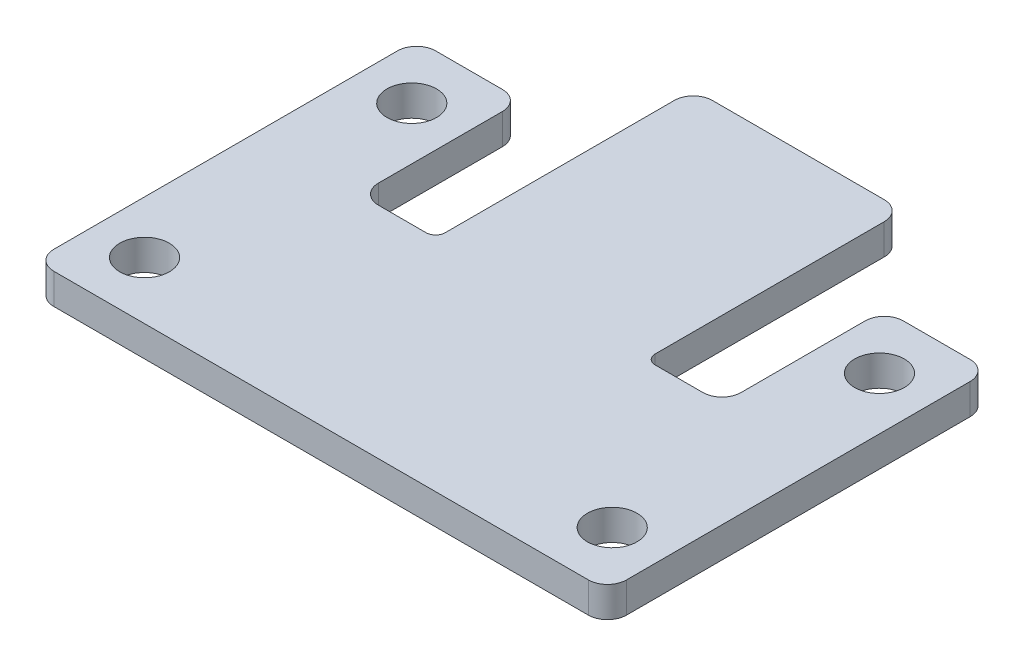
ISO-10303-21;
HEADER;
FILE_DESCRIPTION(('STEP AP214'),'2;1');
FILE_NAME('part.step','',(''),(''),'','','');
FILE_SCHEMA(('AUTOMOTIVE_DESIGN { 1 0 10303 214 1 1 1 1 }'));
ENDSEC;
DATA;
#1=APPLICATION_CONTEXT('core data for automotive mechanical design processes');
#2=APPLICATION_PROTOCOL_DEFINITION('international standard','automotive_design',2000,#1);
#3=PRODUCT_CONTEXT('',#1,'mechanical');
#4=PRODUCT('Part','Part','',(#3));
#5=PRODUCT_RELATED_PRODUCT_CATEGORY('part','',(#4));
#6=PRODUCT_DEFINITION_FORMATION('','',#4);
#7=PRODUCT_DEFINITION_CONTEXT('part definition',#1,'design');
#8=PRODUCT_DEFINITION('design','',#6,#7);
#9=PRODUCT_DEFINITION_SHAPE('','',#8);
#10=(LENGTH_UNIT() NAMED_UNIT(*) SI_UNIT(.MILLI.,.METRE.));
#11=(NAMED_UNIT(*) PLANE_ANGLE_UNIT() SI_UNIT($,.RADIAN.));
#12=(NAMED_UNIT(*) SI_UNIT($,.STERADIAN.) SOLID_ANGLE_UNIT());
#13=UNCERTAINTY_MEASURE_WITH_UNIT(LENGTH_MEASURE(1.E-05),#10,'distance_accuracy_value','');
#14=(GEOMETRIC_REPRESENTATION_CONTEXT(3) GLOBAL_UNCERTAINTY_ASSIGNED_CONTEXT((#13)) GLOBAL_UNIT_ASSIGNED_CONTEXT((#10,
#11,#12)) REPRESENTATION_CONTEXT('',''));
#15=CARTESIAN_POINT('',(0.,0.,0.));
#16=DIRECTION('',(0.,0.,1.));
#17=DIRECTION('',(1.,0.,0.));
#18=AXIS2_PLACEMENT_3D('',#15,#16,#17);
#19=CARTESIAN_POINT('',(0.,0.,0.));
#20=DIRECTION('',(0.,1.,0.));
#21=DIRECTION('',(0.,0.,1.));
#22=AXIS2_PLACEMENT_3D('',#19,#20,#21);
#23=PLANE('',#22);
#24=CARTESIAN_POINT('',(-12.25,0.,-17.));
#25=DIRECTION('',(0.,1.,0.));
#26=DIRECTION('',(0.,0.,1.));
#27=AXIS2_PLACEMENT_3D('',#24,#25,#26);
#28=CIRCLE('',#27,1.3);
#29=CARTESIAN_POINT('',(-12.25,0.,-15.7));
#30=VERTEX_POINT('',#29);
#31=EDGE_CURVE('E618',#30,#30,#28,.F.);
#32=ORIENTED_EDGE('',*,*,#31,.F.);
#33=EDGE_LOOP('',(#32));
#34=FACE_BOUND('',#33,.T.);
#35=CARTESIAN_POINT('',(12.25,0.,-17.));
#36=DIRECTION('',(0.,1.,0.));
#37=DIRECTION('',(0.,0.,1.));
#38=AXIS2_PLACEMENT_3D('',#35,#36,#37);
#39=CIRCLE('',#38,1.3);
#40=CARTESIAN_POINT('',(12.25,0.,-15.7));
#41=VERTEX_POINT('',#40);
#42=EDGE_CURVE('E227',#41,#41,#39,.F.);
#43=ORIENTED_EDGE('',*,*,#42,.F.);
#44=EDGE_LOOP('',(#43));
#45=FACE_BOUND('',#44,.T.);
#46=DIRECTION('',(-1.,0.,0.));
#47=VECTOR('',#46,1.);
#48=CARTESIAN_POINT('',(-9.5,0.,-20.));
#49=LINE('',#48,#47);
#50=CARTESIAN_POINT('',(-10.5,0.,-20.));
#51=VERTEX_POINT('',#50);
#52=CARTESIAN_POINT('',(-14.,0.,-20.));
#53=VERTEX_POINT('',#52);
#54=EDGE_CURVE('E216',#51,#53,#49,.T.);
#55=ORIENTED_EDGE('',*,*,#54,.F.);
#56=CARTESIAN_POINT('',(-10.5,0.,-19.));
#57=DIRECTION('',(0.,1.,0.));
#58=DIRECTION('',(0.,0.,1.));
#59=AXIS2_PLACEMENT_3D('',#56,#57,#58);
#60=CIRCLE('',#59,1.);
#61=CARTESIAN_POINT('',(-9.5,0.,-19.));
#62=VERTEX_POINT('',#61);
#63=EDGE_CURVE('E200',#51,#62,#60,.F.);
#64=ORIENTED_EDGE('',*,*,#63,.T.);
#65=DIRECTION('',(0.,0.,-1.));
#66=VECTOR('',#65,1.);
#67=CARTESIAN_POINT('',(-9.5,0.,-11.5));
#68=LINE('',#67,#66);
#69=CARTESIAN_POINT('',(-9.5,0.,-12.5));
#70=VERTEX_POINT('',#69);
#71=EDGE_CURVE('E262',#70,#62,#68,.T.);
#72=ORIENTED_EDGE('',*,*,#71,.F.);
#73=CARTESIAN_POINT('',(-8.5,0.,-12.5));
#74=DIRECTION('',(0.,1.,0.));
#75=DIRECTION('',(0.,0.,1.));
#76=AXIS2_PLACEMENT_3D('',#73,#74,#75);
#77=CIRCLE('',#76,1.);
#78=CARTESIAN_POINT('',(-8.5,0.,-11.5));
#79=VERTEX_POINT('',#78);
#80=EDGE_CURVE('E338',#70,#79,#77,.T.);
#81=ORIENTED_EDGE('',*,*,#80,.T.);
#82=DIRECTION('',(-1.,0.,0.));
#83=VECTOR('',#82,1.);
#84=CARTESIAN_POINT('',(-5.5,0.,-11.5));
#85=LINE('',#84,#83);
#86=CARTESIAN_POINT('',(-6.,0.,-11.5));
#87=VERTEX_POINT('',#86);
#88=EDGE_CURVE('E260',#87,#79,#85,.T.);
#89=ORIENTED_EDGE('',*,*,#88,.F.);
#90=CARTESIAN_POINT('',(-6.,0.,-12.));
#91=DIRECTION('',(0.,1.,0.));
#92=DIRECTION('',(0.,0.,1.));
#93=AXIS2_PLACEMENT_3D('',#90,#91,#92);
#94=CIRCLE('',#93,0.5);
#95=CARTESIAN_POINT('',(-5.5,0.,-12.));
#96=VERTEX_POINT('',#95);
#97=EDGE_CURVE('E47',#87,#96,#94,.T.);
#98=ORIENTED_EDGE('',*,*,#97,.T.);
#99=DIRECTION('',(0.,0.,1.));
#100=VECTOR('',#99,1.);
#101=CARTESIAN_POINT('',(-5.5,0.,-25.));
#102=LINE('',#101,#100);
#103=CARTESIAN_POINT('',(-5.5,0.,-24.));
#104=VERTEX_POINT('',#103);
#105=EDGE_CURVE('E258',#104,#96,#102,.T.);
#106=ORIENTED_EDGE('',*,*,#105,.F.);
#107=CARTESIAN_POINT('',(-4.5,0.,-24.));
#108=DIRECTION('',(0.,1.,0.));
#109=DIRECTION('',(0.,0.,1.));
#110=AXIS2_PLACEMENT_3D('',#107,#108,#109);
#111=CIRCLE('',#110,1.);
#112=CARTESIAN_POINT('',(-4.5,0.,-25.));
#113=VERTEX_POINT('',#112);
#114=EDGE_CURVE('E210',#104,#113,#111,.F.);
#115=ORIENTED_EDGE('',*,*,#114,.T.);
#116=DIRECTION('',(-1.,0.,0.));
#117=VECTOR('',#116,1.);
#118=CARTESIAN_POINT('',(5.5,0.,-25.));
#119=LINE('',#118,#117);
#120=CARTESIAN_POINT('',(4.5,0.,-25.));
#121=VERTEX_POINT('',#120);
#122=EDGE_CURVE('E255',#121,#113,#119,.T.);
#123=ORIENTED_EDGE('',*,*,#122,.F.);
#124=CARTESIAN_POINT('',(4.5,0.,-24.));
#125=DIRECTION('',(0.,1.,0.));
#126=DIRECTION('',(0.,0.,1.));
#127=AXIS2_PLACEMENT_3D('',#124,#125,#126);
#128=CIRCLE('',#127,1.);
#129=CARTESIAN_POINT('',(5.5,0.,-24.));
#130=VERTEX_POINT('',#129);
#131=EDGE_CURVE('E273',#121,#130,#128,.F.);
#132=ORIENTED_EDGE('',*,*,#131,.T.);
#133=DIRECTION('',(0.,0.,-1.));
#134=VECTOR('',#133,1.);
#135=CARTESIAN_POINT('',(5.5,0.,-11.5));
#136=LINE('',#135,#134);
#137=CARTESIAN_POINT('',(5.5,0.,-12.));
#138=VERTEX_POINT('',#137);
#139=EDGE_CURVE('E253',#138,#130,#136,.T.);
#140=ORIENTED_EDGE('',*,*,#139,.F.);
#141=CARTESIAN_POINT('',(6.,0.,-12.));
#142=DIRECTION('',(0.,1.,0.));
#143=DIRECTION('',(0.,0.,1.));
#144=AXIS2_PLACEMENT_3D('',#141,#142,#143);
#145=CIRCLE('',#144,0.5);
#146=CARTESIAN_POINT('',(6.,0.,-11.5));
#147=VERTEX_POINT('',#146);
#148=EDGE_CURVE('E356',#138,#147,#145,.T.);
#149=ORIENTED_EDGE('',*,*,#148,.T.);
#150=DIRECTION('',(-1.,0.,0.));
#151=VECTOR('',#150,1.);
#152=CARTESIAN_POINT('',(9.5,0.,-11.5));
#153=LINE('',#152,#151);
#154=CARTESIAN_POINT('',(8.5,0.,-11.5));
#155=VERTEX_POINT('',#154);
#156=EDGE_CURVE('E250',#155,#147,#153,.T.);
#157=ORIENTED_EDGE('',*,*,#156,.F.);
#158=CARTESIAN_POINT('',(8.5,0.,-12.5));
#159=DIRECTION('',(0.,1.,0.));
#160=DIRECTION('',(0.,0.,1.));
#161=AXIS2_PLACEMENT_3D('',#158,#159,#160);
#162=CIRCLE('',#161,1.);
#163=CARTESIAN_POINT('',(9.5,0.,-12.5));
#164=VERTEX_POINT('',#163);
#165=EDGE_CURVE('E343',#155,#164,#162,.T.);
#166=ORIENTED_EDGE('',*,*,#165,.T.);
#167=DIRECTION('',(0.,0.,1.));
#168=VECTOR('',#167,1.);
#169=CARTESIAN_POINT('',(9.5,0.,-20.));
#170=LINE('',#169,#168);
#171=CARTESIAN_POINT('',(9.5,0.,-19.));
#172=VERTEX_POINT('',#171);
#173=EDGE_CURVE('E247',#172,#164,#170,.T.);
#174=ORIENTED_EDGE('',*,*,#173,.F.);
#175=CARTESIAN_POINT('',(10.5,0.,-19.));
#176=DIRECTION('',(0.,1.,0.));
#177=DIRECTION('',(0.,0.,1.));
#178=AXIS2_PLACEMENT_3D('',#175,#176,#177);
#179=CIRCLE('',#178,1.);
#180=CARTESIAN_POINT('',(10.5,0.,-20.));
#181=VERTEX_POINT('',#180);
#182=EDGE_CURVE('E271',#172,#181,#179,.F.);
#183=ORIENTED_EDGE('',*,*,#182,.T.);
#184=DIRECTION('',(-1.,0.,0.));
#185=VECTOR('',#184,1.);
#186=CARTESIAN_POINT('',(15.,0.,-20.));
#187=LINE('',#186,#185);
#188=CARTESIAN_POINT('',(14.,0.,-20.));
#189=VERTEX_POINT('',#188);
#190=EDGE_CURVE('E244',#189,#181,#187,.T.);
#191=ORIENTED_EDGE('',*,*,#190,.F.);
#192=CARTESIAN_POINT('',(14.,0.,-19.));
#193=DIRECTION('',(0.,1.,0.));
#194=DIRECTION('',(0.,0.,1.));
#195=AXIS2_PLACEMENT_3D('',#192,#193,#194);
#196=CIRCLE('',#195,1.);
#197=CARTESIAN_POINT('',(15.,0.,-19.));
#198=VERTEX_POINT('',#197);
#199=EDGE_CURVE('E220',#189,#198,#196,.F.);
#200=ORIENTED_EDGE('',*,*,#199,.T.);
#201=DIRECTION('',(0.,0.,-1.));
#202=VECTOR('',#201,1.);
#203=CARTESIAN_POINT('',(15.,0.,0.));
#204=LINE('',#203,#202);
#205=CARTESIAN_POINT('',(15.,0.,-1.));
#206=VERTEX_POINT('',#205);
#207=EDGE_CURVE('E241',#206,#198,#204,.T.);
#208=ORIENTED_EDGE('',*,*,#207,.F.);
#209=CARTESIAN_POINT('',(14.,0.,-1.));
#210=DIRECTION('',(0.,1.,0.));
#211=DIRECTION('',(0.,0.,1.));
#212=AXIS2_PLACEMENT_3D('',#209,#210,#211);
#213=CIRCLE('',#212,1.);
#214=CARTESIAN_POINT('',(14.,0.,0.));
#215=VERTEX_POINT('',#214);
#216=EDGE_CURVE('E269',#206,#215,#213,.F.);
#217=ORIENTED_EDGE('',*,*,#216,.T.);
#218=DIRECTION('',(1.,0.,0.));
#219=VECTOR('',#218,1.);
#220=CARTESIAN_POINT('',(-15.,0.,0.));
#221=LINE('',#220,#219);
#222=CARTESIAN_POINT('',(-14.,0.,0.));
#223=VERTEX_POINT('',#222);
#224=EDGE_CURVE('E230',#223,#215,#221,.T.);
#225=ORIENTED_EDGE('',*,*,#224,.F.);
#226=CARTESIAN_POINT('',(-14.,0.,-1.));
#227=DIRECTION('',(0.,1.,0.));
#228=DIRECTION('',(0.,0.,1.));
#229=AXIS2_PLACEMENT_3D('',#226,#227,#228);
#230=CIRCLE('',#229,1.);
#231=CARTESIAN_POINT('',(-15.,0.,-1.));
#232=VERTEX_POINT('',#231);
#233=EDGE_CURVE('E267',#223,#232,#230,.F.);
#234=ORIENTED_EDGE('',*,*,#233,.T.);
#235=DIRECTION('',(0.,0.,1.));
#236=VECTOR('',#235,1.);
#237=CARTESIAN_POINT('',(-15.,0.,-20.));
#238=LINE('',#237,#236);
#239=CARTESIAN_POINT('',(-15.,0.,-19.));
#240=VERTEX_POINT('',#239);
#241=EDGE_CURVE('E226',#240,#232,#238,.T.);
#242=ORIENTED_EDGE('',*,*,#241,.F.);
#243=CARTESIAN_POINT('',(-14.,0.,-19.));
#244=DIRECTION('',(0.,1.,0.));
#245=DIRECTION('',(0.,0.,1.));
#246=AXIS2_PLACEMENT_3D('',#243,#244,#245);
#247=CIRCLE('',#246,1.);
#248=EDGE_CURVE('E225',#240,#53,#247,.F.);
#249=ORIENTED_EDGE('',*,*,#248,.T.);
#250=EDGE_LOOP('',(#55,#64,#72,#81,#89,#98,#106,#115,#123,#132,#140,#149,#157,#166,#174,#183,
#191,#200,#208,#217,#225,#234,#242,#249));
#251=FACE_BOUND('',#250,.T.);
#252=CARTESIAN_POINT('',(12.25,0.,-3.));
#253=DIRECTION('',(0.,1.,0.));
#254=DIRECTION('',(0.,0.,1.));
#255=AXIS2_PLACEMENT_3D('',#252,#253,#254);
#256=CIRCLE('',#255,1.3);
#257=CARTESIAN_POINT('',(12.25,0.,-1.7));
#258=VERTEX_POINT('',#257);
#259=EDGE_CURVE('E633',#258,#258,#256,.F.);
#260=ORIENTED_EDGE('',*,*,#259,.F.);
#261=EDGE_LOOP('',(#260));
#262=FACE_BOUND('',#261,.T.);
#263=CARTESIAN_POINT('',(-12.25,0.,-3.));
#264=DIRECTION('',(0.,1.,0.));
#265=DIRECTION('',(0.,0.,1.));
#266=AXIS2_PLACEMENT_3D('',#263,#264,#265);
#267=CIRCLE('',#266,1.3);
#268=CARTESIAN_POINT('',(-12.25,0.,-1.7));
#269=VERTEX_POINT('',#268);
#270=EDGE_CURVE('E627',#269,#269,#267,.F.);
#271=ORIENTED_EDGE('',*,*,#270,.F.);
#272=EDGE_LOOP('',(#271));
#273=FACE_BOUND('',#272,.T.);
#274=ADVANCED_FACE('F39',(#34,#45,#251,#262,#273),#23,.F.);
#275=CARTESIAN_POINT('',(-9.5,1.6,-20.));
#276=DIRECTION('',(0.,0.,1.));
#277=DIRECTION('',(1.,0.,0.));
#278=AXIS2_PLACEMENT_3D('',#275,#276,#277);
#279=PLANE('',#278);
#280=DIRECTION('',(-1.,0.,0.));
#281=VECTOR('',#280,1.);
#282=CARTESIAN_POINT('',(-9.5,1.6,-20.));
#283=LINE('',#282,#281);
#284=CARTESIAN_POINT('',(-10.5,1.6,-20.));
#285=VERTEX_POINT('',#284);
#286=CARTESIAN_POINT('',(-14.,1.6,-20.));
#287=VERTEX_POINT('',#286);
#288=EDGE_CURVE('E219',#285,#287,#283,.T.);
#289=ORIENTED_EDGE('',*,*,#288,.F.);
#290=DIRECTION('',(0.,-1.,0.));
#291=VECTOR('',#290,1.);
#292=CARTESIAN_POINT('',(-10.5,1.6,-20.));
#293=LINE('',#292,#291);
#294=EDGE_CURVE('E204',#285,#51,#293,.T.);
#295=ORIENTED_EDGE('',*,*,#294,.T.);
#296=ORIENTED_EDGE('',*,*,#54,.T.);
#297=DIRECTION('',(0.,-1.,0.));
#298=VECTOR('',#297,1.);
#299=CARTESIAN_POINT('',(-14.,1.6,-20.));
#300=LINE('',#299,#298);
#301=EDGE_CURVE('E221',#53,#287,#300,.F.);
#302=ORIENTED_EDGE('',*,*,#301,.T.);
#303=EDGE_LOOP('',(#289,#295,#296,#302));
#304=FACE_BOUND('',#303,.T.);
#305=ADVANCED_FACE('F215',(#304),#279,.F.);
#306=CARTESIAN_POINT('',(-15.,1.6,-20.));
#307=DIRECTION('',(1.,0.,0.));
#308=DIRECTION('',(0.,0.,-1.));
#309=AXIS2_PLACEMENT_3D('',#306,#307,#308);
#310=PLANE('',#309);
#311=ORIENTED_EDGE('',*,*,#241,.T.);
#312=DIRECTION('',(0.,-1.,0.));
#313=VECTOR('',#312,1.);
#314=CARTESIAN_POINT('',(-15.,1.6,-1.));
#315=LINE('',#314,#313);
#316=CARTESIAN_POINT('',(-15.,1.6,-1.));
#317=VERTEX_POINT('',#316);
#318=EDGE_CURVE('E336',#232,#317,#315,.F.);
#319=ORIENTED_EDGE('',*,*,#318,.T.);
#320=DIRECTION('',(0.,0.,1.));
#321=VECTOR('',#320,1.);
#322=CARTESIAN_POINT('',(-15.,1.6,-20.));
#323=LINE('',#322,#321);
#324=CARTESIAN_POINT('',(-15.,1.6,-19.));
#325=VERTEX_POINT('',#324);
#326=EDGE_CURVE('E436',#325,#317,#323,.T.);
#327=ORIENTED_EDGE('',*,*,#326,.F.);
#328=DIRECTION('',(0.,-1.,0.));
#329=VECTOR('',#328,1.);
#330=CARTESIAN_POINT('',(-15.,1.6,-19.));
#331=LINE('',#330,#329);
#332=EDGE_CURVE('E333',#325,#240,#331,.T.);
#333=ORIENTED_EDGE('',*,*,#332,.T.);
#334=EDGE_LOOP('',(#311,#319,#327,#333));
#335=FACE_BOUND('',#334,.T.);
#336=ADVANCED_FACE('F432',(#335),#310,.F.);
#337=CARTESIAN_POINT('',(-15.,1.6,0.));
#338=DIRECTION('',(0.,0.,-1.));
#339=DIRECTION('',(-1.,0.,0.));
#340=AXIS2_PLACEMENT_3D('',#337,#338,#339);
#341=PLANE('',#340);
#342=ORIENTED_EDGE('',*,*,#224,.T.);
#343=DIRECTION('',(0.,-1.,0.));
#344=VECTOR('',#343,1.);
#345=CARTESIAN_POINT('',(14.,1.6,0.));
#346=LINE('',#345,#344);
#347=CARTESIAN_POINT('',(14.,1.6,0.));
#348=VERTEX_POINT('',#347);
#349=EDGE_CURVE('E331',#215,#348,#346,.F.);
#350=ORIENTED_EDGE('',*,*,#349,.T.);
#351=DIRECTION('',(1.,0.,0.));
#352=VECTOR('',#351,1.);
#353=CARTESIAN_POINT('',(-15.,1.6,0.));
#354=LINE('',#353,#352);
#355=CARTESIAN_POINT('',(-14.,1.6,0.));
#356=VERTEX_POINT('',#355);
#357=EDGE_CURVE('E426',#356,#348,#354,.T.);
#358=ORIENTED_EDGE('',*,*,#357,.F.);
#359=DIRECTION('',(0.,-1.,0.));
#360=VECTOR('',#359,1.);
#361=CARTESIAN_POINT('',(-14.,1.6,0.));
#362=LINE('',#361,#360);
#363=EDGE_CURVE('E328',#356,#223,#362,.T.);
#364=ORIENTED_EDGE('',*,*,#363,.T.);
#365=EDGE_LOOP('',(#342,#350,#358,#364));
#366=FACE_BOUND('',#365,.T.);
#367=ADVANCED_FACE('F422',(#366),#341,.F.);
#368=CARTESIAN_POINT('',(15.,1.6,0.));
#369=DIRECTION('',(-1.,0.,0.));
#370=DIRECTION('',(0.,0.,1.));
#371=AXIS2_PLACEMENT_3D('',#368,#369,#370);
#372=PLANE('',#371);
#373=DIRECTION('',(0.,0.,-1.));
#374=VECTOR('',#373,1.);
#375=CARTESIAN_POINT('',(15.,1.6,0.));
#376=LINE('',#375,#374);
#377=CARTESIAN_POINT('',(15.,1.6,-1.));
#378=VERTEX_POINT('',#377);
#379=CARTESIAN_POINT('',(15.,1.6,-19.));
#380=VERTEX_POINT('',#379);
#381=EDGE_CURVE('E415',#378,#380,#376,.T.);
#382=ORIENTED_EDGE('',*,*,#381,.F.);
#383=DIRECTION('',(0.,-1.,0.));
#384=VECTOR('',#383,1.);
#385=CARTESIAN_POINT('',(15.,1.6,-1.));
#386=LINE('',#385,#384);
#387=EDGE_CURVE('E325',#378,#206,#386,.T.);
#388=ORIENTED_EDGE('',*,*,#387,.T.);
#389=ORIENTED_EDGE('',*,*,#207,.T.);
#390=DIRECTION('',(0.,-1.,0.));
#391=VECTOR('',#390,1.);
#392=CARTESIAN_POINT('',(15.,1.6,-19.));
#393=LINE('',#392,#391);
#394=EDGE_CURVE('E323',#198,#380,#393,.F.);
#395=ORIENTED_EDGE('',*,*,#394,.T.);
#396=EDGE_LOOP('',(#382,#388,#389,#395));
#397=FACE_BOUND('',#396,.T.);
#398=ADVANCED_FACE('F412',(#397),#372,.F.);
#399=CARTESIAN_POINT('',(15.,1.6,-20.));
#400=DIRECTION('',(0.,0.,1.));
#401=DIRECTION('',(1.,0.,0.));
#402=AXIS2_PLACEMENT_3D('',#399,#400,#401);
#403=PLANE('',#402);
#404=ORIENTED_EDGE('',*,*,#190,.T.);
#405=DIRECTION('',(0.,-1.,0.));
#406=VECTOR('',#405,1.);
#407=CARTESIAN_POINT('',(10.5,1.6,-20.));
#408=LINE('',#407,#406);
#409=CARTESIAN_POINT('',(10.5,1.6,-20.));
#410=VERTEX_POINT('',#409);
#411=EDGE_CURVE('E321',#181,#410,#408,.F.);
#412=ORIENTED_EDGE('',*,*,#411,.T.);
#413=DIRECTION('',(-1.,0.,0.));
#414=VECTOR('',#413,1.);
#415=CARTESIAN_POINT('',(15.,1.6,-20.));
#416=LINE('',#415,#414);
#417=CARTESIAN_POINT('',(14.,1.6,-20.));
#418=VERTEX_POINT('',#417);
#419=EDGE_CURVE('E404',#418,#410,#416,.T.);
#420=ORIENTED_EDGE('',*,*,#419,.F.);
#421=DIRECTION('',(0.,-1.,0.));
#422=VECTOR('',#421,1.);
#423=CARTESIAN_POINT('',(14.,1.6,-20.));
#424=LINE('',#423,#422);
#425=EDGE_CURVE('E318',#418,#189,#424,.T.);
#426=ORIENTED_EDGE('',*,*,#425,.T.);
#427=EDGE_LOOP('',(#404,#412,#420,#426));
#428=FACE_BOUND('',#427,.T.);
#429=ADVANCED_FACE('F400',(#428),#403,.F.);
#430=CARTESIAN_POINT('',(9.5,1.6,-20.));
#431=DIRECTION('',(1.,0.,0.));
#432=DIRECTION('',(0.,0.,-1.));
#433=AXIS2_PLACEMENT_3D('',#430,#431,#432);
#434=PLANE('',#433);
#435=ORIENTED_EDGE('',*,*,#173,.T.);
#436=DIRECTION('',(0.,-1.,0.));
#437=VECTOR('',#436,1.);
#438=CARTESIAN_POINT('',(9.5,1.6,-12.5));
#439=LINE('',#438,#437);
#440=CARTESIAN_POINT('',(9.5,1.6,-12.5));
#441=VERTEX_POINT('',#440);
#442=EDGE_CURVE('E316',#164,#441,#439,.F.);
#443=ORIENTED_EDGE('',*,*,#442,.T.);
#444=DIRECTION('',(0.,0.,1.));
#445=VECTOR('',#444,1.);
#446=CARTESIAN_POINT('',(9.5,1.6,-20.));
#447=LINE('',#446,#445);
#448=CARTESIAN_POINT('',(9.5,1.6,-19.));
#449=VERTEX_POINT('',#448);
#450=EDGE_CURVE('E393',#449,#441,#447,.T.);
#451=ORIENTED_EDGE('',*,*,#450,.F.);
#452=DIRECTION('',(0.,-1.,0.));
#453=VECTOR('',#452,1.);
#454=CARTESIAN_POINT('',(9.5,1.6,-19.));
#455=LINE('',#454,#453);
#456=EDGE_CURVE('E313',#449,#172,#455,.T.);
#457=ORIENTED_EDGE('',*,*,#456,.T.);
#458=EDGE_LOOP('',(#435,#443,#451,#457));
#459=FACE_BOUND('',#458,.T.);
#460=ADVANCED_FACE('F389',(#459),#434,.F.);
#461=CARTESIAN_POINT('',(9.5,1.6,-11.5));
#462=DIRECTION('',(0.,0.,1.));
#463=DIRECTION('',(1.,0.,0.));
#464=AXIS2_PLACEMENT_3D('',#461,#462,#463);
#465=PLANE('',#464);
#466=ORIENTED_EDGE('',*,*,#156,.T.);
#467=DIRECTION('',(0.,-1.,0.));
#468=VECTOR('',#467,1.);
#469=CARTESIAN_POINT('',(6.,1.6,-11.5));
#470=LINE('',#469,#468);
#471=CARTESIAN_POINT('',(6.,1.6,-11.5));
#472=VERTEX_POINT('',#471);
#473=EDGE_CURVE('E350',#147,#472,#470,.F.);
#474=ORIENTED_EDGE('',*,*,#473,.T.);
#475=DIRECTION('',(-1.,0.,0.));
#476=VECTOR('',#475,1.);
#477=CARTESIAN_POINT('',(9.5,1.6,-11.5));
#478=LINE('',#477,#476);
#479=CARTESIAN_POINT('',(8.5,1.6,-11.5));
#480=VERTEX_POINT('',#479);
#481=EDGE_CURVE('E367',#480,#472,#478,.T.);
#482=ORIENTED_EDGE('',*,*,#481,.F.);
#483=DIRECTION('',(0.,-1.,0.));
#484=VECTOR('',#483,1.);
#485=CARTESIAN_POINT('',(8.5,0.,-11.5));
#486=LINE('',#485,#484);
#487=EDGE_CURVE('E310',#480,#155,#486,.T.);
#488=ORIENTED_EDGE('',*,*,#487,.T.);
#489=EDGE_LOOP('',(#466,#474,#482,#488));
#490=FACE_BOUND('',#489,.T.);
#491=ADVANCED_FACE('F381',(#490),#465,.F.);
#492=CARTESIAN_POINT('',(5.5,1.6,-11.5));
#493=DIRECTION('',(-1.,0.,0.));
#494=DIRECTION('',(0.,0.,1.));
#495=AXIS2_PLACEMENT_3D('',#492,#493,#494);
#496=PLANE('',#495);
#497=DIRECTION('',(0.,0.,-1.));
#498=VECTOR('',#497,1.);
#499=CARTESIAN_POINT('',(5.5,1.6,-11.5));
#500=LINE('',#499,#498);
#501=CARTESIAN_POINT('',(5.5,1.6,-12.));
#502=VERTEX_POINT('',#501);
#503=CARTESIAN_POINT('',(5.5,1.6,-24.));
#504=VERTEX_POINT('',#503);
#505=EDGE_CURVE('E365',#502,#504,#500,.T.);
#506=ORIENTED_EDGE('',*,*,#505,.F.);
#507=DIRECTION('',(0.,-1.,0.));
#508=VECTOR('',#507,1.);
#509=CARTESIAN_POINT('',(5.5,0.,-12.));
#510=LINE('',#509,#508);
#511=EDGE_CURVE('E347',#502,#138,#510,.T.);
#512=ORIENTED_EDGE('',*,*,#511,.T.);
#513=ORIENTED_EDGE('',*,*,#139,.T.);
#514=DIRECTION('',(0.,-1.,0.));
#515=VECTOR('',#514,1.);
#516=CARTESIAN_POINT('',(5.5,1.6,-24.));
#517=LINE('',#516,#515);
#518=EDGE_CURVE('E307',#130,#504,#517,.F.);
#519=ORIENTED_EDGE('',*,*,#518,.T.);
#520=EDGE_LOOP('',(#506,#512,#513,#519));
#521=FACE_BOUND('',#520,.T.);
#522=ADVANCED_FACE('F372',(#521),#496,.F.);
#523=CARTESIAN_POINT('',(5.5,1.6,-25.));
#524=DIRECTION('',(0.,0.,1.));
#525=DIRECTION('',(1.,0.,0.));
#526=AXIS2_PLACEMENT_3D('',#523,#524,#525);
#527=PLANE('',#526);
#528=ORIENTED_EDGE('',*,*,#122,.T.);
#529=DIRECTION('',(0.,-1.,0.));
#530=VECTOR('',#529,1.);
#531=CARTESIAN_POINT('',(-4.5,1.6,-25.));
#532=LINE('',#531,#530);
#533=CARTESIAN_POINT('',(-4.5,1.6,-25.));
#534=VERTEX_POINT('',#533);
#535=EDGE_CURVE('E305',#113,#534,#532,.F.);
#536=ORIENTED_EDGE('',*,*,#535,.T.);
#537=DIRECTION('',(-1.,0.,0.));
#538=VECTOR('',#537,1.);
#539=CARTESIAN_POINT('',(5.5,1.6,-25.));
#540=LINE('',#539,#538);
#541=CARTESIAN_POINT('',(4.5,1.6,-25.));
#542=VERTEX_POINT('',#541);
#543=EDGE_CURVE('E376',#542,#534,#540,.T.);
#544=ORIENTED_EDGE('',*,*,#543,.F.);
#545=DIRECTION('',(0.,-1.,0.));
#546=VECTOR('',#545,1.);
#547=CARTESIAN_POINT('',(4.5,1.6,-25.));
#548=LINE('',#547,#546);
#549=EDGE_CURVE('E302',#542,#121,#548,.T.);
#550=ORIENTED_EDGE('',*,*,#549,.T.);
#551=EDGE_LOOP('',(#528,#536,#544,#550));
#552=FACE_BOUND('',#551,.T.);
#553=ADVANCED_FACE('F475',(#552),#527,.F.);
#554=CARTESIAN_POINT('',(-5.5,1.6,-25.));
#555=DIRECTION('',(1.,0.,0.));
#556=DIRECTION('',(0.,0.,-1.));
#557=AXIS2_PLACEMENT_3D('',#554,#555,#556);
#558=PLANE('',#557);
#559=ORIENTED_EDGE('',*,*,#105,.T.);
#560=DIRECTION('',(0.,-1.,0.));
#561=VECTOR('',#560,1.);
#562=CARTESIAN_POINT('',(-5.5,1.6,-12.));
#563=LINE('',#562,#561);
#564=CARTESIAN_POINT('',(-5.5,1.6,-12.));
#565=VERTEX_POINT('',#564);
#566=EDGE_CURVE('E60',#96,#565,#563,.F.);
#567=ORIENTED_EDGE('',*,*,#566,.T.);
#568=DIRECTION('',(0.,0.,1.));
#569=VECTOR('',#568,1.);
#570=CARTESIAN_POINT('',(-5.5,1.6,-25.));
#571=LINE('',#570,#569);
#572=CARTESIAN_POINT('',(-5.5,1.6,-24.));
#573=VERTEX_POINT('',#572);
#574=EDGE_CURVE('E451',#573,#565,#571,.T.);
#575=ORIENTED_EDGE('',*,*,#574,.F.);
#576=DIRECTION('',(0.,-1.,0.));
#577=VECTOR('',#576,1.);
#578=CARTESIAN_POINT('',(-5.5,1.6,-24.));
#579=LINE('',#578,#577);
#580=EDGE_CURVE('E299',#573,#104,#579,.T.);
#581=ORIENTED_EDGE('',*,*,#580,.T.);
#582=EDGE_LOOP('',(#559,#567,#575,#581));
#583=FACE_BOUND('',#582,.T.);
#584=ADVANCED_FACE('F469',(#583),#558,.F.);
#585=CARTESIAN_POINT('',(-5.5,1.6,-11.5));
#586=DIRECTION('',(0.,0.,1.));
#587=DIRECTION('',(1.,0.,0.));
#588=AXIS2_PLACEMENT_3D('',#585,#586,#587);
#589=PLANE('',#588);
#590=DIRECTION('',(-1.,0.,0.));
#591=VECTOR('',#590,1.);
#592=CARTESIAN_POINT('',(-5.5,1.6,-11.5));
#593=LINE('',#592,#591);
#594=CARTESIAN_POINT('',(-6.,1.6,-11.5));
#595=VERTEX_POINT('',#594);
#596=CARTESIAN_POINT('',(-8.5,1.6,-11.5));
#597=VERTEX_POINT('',#596);
#598=EDGE_CURVE('E452',#595,#597,#593,.T.);
#599=ORIENTED_EDGE('',*,*,#598,.F.);
#600=DIRECTION('',(0.,-1.,0.));
#601=VECTOR('',#600,1.);
#602=CARTESIAN_POINT('',(-6.,0.,-11.5));
#603=LINE('',#602,#601);
#604=EDGE_CURVE('E352',#595,#87,#603,.T.);
#605=ORIENTED_EDGE('',*,*,#604,.T.);
#606=ORIENTED_EDGE('',*,*,#88,.T.);
#607=DIRECTION('',(0.,-1.,0.));
#608=VECTOR('',#607,1.);
#609=CARTESIAN_POINT('',(-8.5,1.6,-11.5));
#610=LINE('',#609,#608);
#611=EDGE_CURVE('E296',#79,#597,#610,.F.);
#612=ORIENTED_EDGE('',*,*,#611,.T.);
#613=EDGE_LOOP('',(#599,#605,#606,#612));
#614=FACE_BOUND('',#613,.T.);
#615=ADVANCED_FACE('F463',(#614),#589,.F.);
#616=CARTESIAN_POINT('',(-9.5,1.6,-11.5));
#617=DIRECTION('',(-1.,0.,0.));
#618=DIRECTION('',(0.,0.,1.));
#619=AXIS2_PLACEMENT_3D('',#616,#617,#618);
#620=PLANE('',#619);
#621=ORIENTED_EDGE('',*,*,#71,.T.);
#622=DIRECTION('',(0.,-1.,0.));
#623=VECTOR('',#622,1.);
#624=CARTESIAN_POINT('',(-9.5,1.6,-19.));
#625=LINE('',#624,#623);
#626=CARTESIAN_POINT('',(-9.5,1.6,-19.));
#627=VERTEX_POINT('',#626);
#628=EDGE_CURVE('E205',#62,#627,#625,.F.);
#629=ORIENTED_EDGE('',*,*,#628,.T.);
#630=DIRECTION('',(0.,0.,-1.));
#631=VECTOR('',#630,1.);
#632=CARTESIAN_POINT('',(-9.5,1.6,-11.5));
#633=LINE('',#632,#631);
#634=CARTESIAN_POINT('',(-9.5,1.6,-12.5));
#635=VERTEX_POINT('',#634);
#636=EDGE_CURVE('E236',#635,#627,#633,.T.);
#637=ORIENTED_EDGE('',*,*,#636,.F.);
#638=DIRECTION('',(0.,-1.,0.));
#639=VECTOR('',#638,1.);
#640=CARTESIAN_POINT('',(-9.5,0.,-12.5));
#641=LINE('',#640,#639);
#642=EDGE_CURVE('E209',#635,#70,#641,.T.);
#643=ORIENTED_EDGE('',*,*,#642,.T.);
#644=EDGE_LOOP('',(#621,#629,#637,#643));
#645=FACE_BOUND('',#644,.T.);
#646=ADVANCED_FACE('F458',(#645),#620,.F.);
#647=CARTESIAN_POINT('',(0.,1.6,0.));
#648=DIRECTION('',(0.,1.,0.));
#649=DIRECTION('',(0.,0.,1.));
#650=AXIS2_PLACEMENT_3D('',#647,#648,#649);
#651=PLANE('',#650);
#652=CARTESIAN_POINT('',(-12.25,1.6,-17.));
#653=DIRECTION('',(0.,1.,0.));
#654=DIRECTION('',(0.,0.,1.));
#655=AXIS2_PLACEMENT_3D('',#652,#653,#654);
#656=CIRCLE('',#655,1.3);
#657=CARTESIAN_POINT('',(-12.25,1.6,-15.7));
#658=VERTEX_POINT('',#657);
#659=EDGE_CURVE('E621',#658,#658,#656,.T.);
#660=ORIENTED_EDGE('',*,*,#659,.F.);
#661=EDGE_LOOP('',(#660));
#662=FACE_BOUND('',#661,.T.);
#663=CARTESIAN_POINT('',(-12.25,1.6,-3.));
#664=DIRECTION('',(0.,1.,0.));
#665=DIRECTION('',(0.,0.,1.));
#666=AXIS2_PLACEMENT_3D('',#663,#664,#665);
#667=CIRCLE('',#666,1.3);
#668=CARTESIAN_POINT('',(-12.25,1.6,-1.7));
#669=VERTEX_POINT('',#668);
#670=EDGE_CURVE('E624',#669,#669,#667,.T.);
#671=ORIENTED_EDGE('',*,*,#670,.F.);
#672=EDGE_LOOP('',(#671));
#673=FACE_BOUND('',#672,.T.);
#674=CARTESIAN_POINT('',(12.25,1.6,-3.));
#675=DIRECTION('',(0.,1.,0.));
#676=DIRECTION('',(0.,0.,1.));
#677=AXIS2_PLACEMENT_3D('',#674,#675,#676);
#678=CIRCLE('',#677,1.3);
#679=CARTESIAN_POINT('',(12.25,1.6,-1.7));
#680=VERTEX_POINT('',#679);
#681=EDGE_CURVE('E630',#680,#680,#678,.T.);
#682=ORIENTED_EDGE('',*,*,#681,.F.);
#683=EDGE_LOOP('',(#682));
#684=FACE_BOUND('',#683,.T.);
#685=CARTESIAN_POINT('',(12.25,1.6,-17.));
#686=DIRECTION('',(0.,1.,0.));
#687=DIRECTION('',(0.,0.,1.));
#688=AXIS2_PLACEMENT_3D('',#685,#686,#687);
#689=CIRCLE('',#688,1.3);
#690=CARTESIAN_POINT('',(12.25,1.6,-15.7));
#691=VERTEX_POINT('',#690);
#692=EDGE_CURVE('E233',#691,#691,#689,.T.);
#693=ORIENTED_EDGE('',*,*,#692,.F.);
#694=EDGE_LOOP('',(#693));
#695=FACE_BOUND('',#694,.T.);
#696=ORIENTED_EDGE('',*,*,#636,.T.);
#697=CARTESIAN_POINT('',(-10.5,1.6,-19.));
#698=DIRECTION('',(0.,1.,0.));
#699=DIRECTION('',(0.,0.,1.));
#700=AXIS2_PLACEMENT_3D('',#697,#698,#699);
#701=CIRCLE('',#700,1.);
#702=EDGE_CURVE('E294',#627,#285,#701,.T.);
#703=ORIENTED_EDGE('',*,*,#702,.T.);
#704=ORIENTED_EDGE('',*,*,#288,.T.);
#705=CARTESIAN_POINT('',(-14.,1.6,-19.));
#706=DIRECTION('',(0.,1.,0.));
#707=DIRECTION('',(0.,0.,1.));
#708=AXIS2_PLACEMENT_3D('',#705,#706,#707);
#709=CIRCLE('',#708,1.);
#710=EDGE_CURVE('E282',#287,#325,#709,.T.);
#711=ORIENTED_EDGE('',*,*,#710,.T.);
#712=ORIENTED_EDGE('',*,*,#326,.T.);
#713=CARTESIAN_POINT('',(-14.,1.6,-1.));
#714=DIRECTION('',(0.,1.,0.));
#715=DIRECTION('',(0.,0.,1.));
#716=AXIS2_PLACEMENT_3D('',#713,#714,#715);
#717=CIRCLE('',#716,1.);
#718=EDGE_CURVE('E284',#317,#356,#717,.T.);
#719=ORIENTED_EDGE('',*,*,#718,.T.);
#720=ORIENTED_EDGE('',*,*,#357,.T.);
#721=CARTESIAN_POINT('',(14.,1.6,-1.));
#722=DIRECTION('',(0.,1.,0.));
#723=DIRECTION('',(0.,0.,1.));
#724=AXIS2_PLACEMENT_3D('',#721,#722,#723);
#725=CIRCLE('',#724,1.);
#726=EDGE_CURVE('E286',#348,#378,#725,.T.);
#727=ORIENTED_EDGE('',*,*,#726,.T.);
#728=ORIENTED_EDGE('',*,*,#381,.T.);
#729=CARTESIAN_POINT('',(14.,1.6,-19.));
#730=DIRECTION('',(0.,1.,0.));
#731=DIRECTION('',(0.,0.,1.));
#732=AXIS2_PLACEMENT_3D('',#729,#730,#731);
#733=CIRCLE('',#732,1.);
#734=EDGE_CURVE('E280',#380,#418,#733,.T.);
#735=ORIENTED_EDGE('',*,*,#734,.T.);
#736=ORIENTED_EDGE('',*,*,#419,.T.);
#737=CARTESIAN_POINT('',(10.5,1.6,-19.));
#738=DIRECTION('',(0.,1.,0.));
#739=DIRECTION('',(0.,0.,1.));
#740=AXIS2_PLACEMENT_3D('',#737,#738,#739);
#741=CIRCLE('',#740,1.);
#742=EDGE_CURVE('E288',#410,#449,#741,.T.);
#743=ORIENTED_EDGE('',*,*,#742,.T.);
#744=ORIENTED_EDGE('',*,*,#450,.T.);
#745=CARTESIAN_POINT('',(8.5,1.6,-12.5));
#746=DIRECTION('',(0.,1.,0.));
#747=DIRECTION('',(0.,0.,1.));
#748=AXIS2_PLACEMENT_3D('',#745,#746,#747);
#749=CIRCLE('',#748,1.);
#750=EDGE_CURVE('E345',#441,#480,#749,.F.);
#751=ORIENTED_EDGE('',*,*,#750,.T.);
#752=ORIENTED_EDGE('',*,*,#481,.T.);
#753=CARTESIAN_POINT('',(6.,1.6,-12.));
#754=DIRECTION('',(0.,1.,0.));
#755=DIRECTION('',(0.,0.,1.));
#756=AXIS2_PLACEMENT_3D('',#753,#754,#755);
#757=CIRCLE('',#756,0.5);
#758=EDGE_CURVE('E358',#472,#502,#757,.F.);
#759=ORIENTED_EDGE('',*,*,#758,.T.);
#760=ORIENTED_EDGE('',*,*,#505,.T.);
#761=CARTESIAN_POINT('',(4.5,1.6,-24.));
#762=DIRECTION('',(0.,1.,0.));
#763=DIRECTION('',(0.,0.,1.));
#764=AXIS2_PLACEMENT_3D('',#761,#762,#763);
#765=CIRCLE('',#764,1.);
#766=EDGE_CURVE('E290',#504,#542,#765,.T.);
#767=ORIENTED_EDGE('',*,*,#766,.T.);
#768=ORIENTED_EDGE('',*,*,#543,.T.);
#769=CARTESIAN_POINT('',(-4.5,1.6,-24.));
#770=DIRECTION('',(0.,1.,0.));
#771=DIRECTION('',(0.,0.,1.));
#772=AXIS2_PLACEMENT_3D('',#769,#770,#771);
#773=CIRCLE('',#772,1.);
#774=EDGE_CURVE('E292',#534,#573,#773,.T.);
#775=ORIENTED_EDGE('',*,*,#774,.T.);
#776=ORIENTED_EDGE('',*,*,#574,.T.);
#777=CARTESIAN_POINT('',(-6.,1.6,-12.));
#778=DIRECTION('',(0.,1.,0.));
#779=DIRECTION('',(0.,0.,1.));
#780=AXIS2_PLACEMENT_3D('',#777,#778,#779);
#781=CIRCLE('',#780,0.5);
#782=EDGE_CURVE('E11',#565,#595,#781,.F.);
#783=ORIENTED_EDGE('',*,*,#782,.T.);
#784=ORIENTED_EDGE('',*,*,#598,.T.);
#785=CARTESIAN_POINT('',(-8.5,1.6,-12.5));
#786=DIRECTION('',(0.,1.,0.));
#787=DIRECTION('',(0.,0.,1.));
#788=AXIS2_PLACEMENT_3D('',#785,#786,#787);
#789=CIRCLE('',#788,1.);
#790=EDGE_CURVE('E341',#597,#635,#789,.F.);
#791=ORIENTED_EDGE('',*,*,#790,.T.);
#792=EDGE_LOOP('',(#696,#703,#704,#711,#712,#719,#720,#727,#728,#735,#736,#743,#744,#751,#752,
#759,#760,#767,#768,#775,#776,#783,#784,#791));
#793=FACE_BOUND('',#792,.T.);
#794=ADVANCED_FACE('F364',(#662,#673,#684,#695,#793),#651,.T.);
#795=CARTESIAN_POINT('',(-10.5,1.6,-19.));
#796=DIRECTION('',(0.,-1.,0.));
#797=DIRECTION('',(0.,0.,-1.));
#798=AXIS2_PLACEMENT_3D('',#795,#796,#797);
#799=CYLINDRICAL_SURFACE('',#798,1.);
#800=ORIENTED_EDGE('',*,*,#702,.F.);
#801=ORIENTED_EDGE('',*,*,#628,.F.);
#802=ORIENTED_EDGE('',*,*,#63,.F.);
#803=ORIENTED_EDGE('',*,*,#294,.F.);
#804=EDGE_LOOP('',(#800,#801,#802,#803));
#805=FACE_BOUND('',#804,.T.);
#806=ADVANCED_FACE('F203',(#805),#799,.T.);
#807=CARTESIAN_POINT('',(-8.5,1.6,-12.5));
#808=DIRECTION('',(0.,1.,0.));
#809=DIRECTION('',(0.,0.,1.));
#810=AXIS2_PLACEMENT_3D('',#807,#808,#809);
#811=CYLINDRICAL_SURFACE('',#810,1.);
#812=ORIENTED_EDGE('',*,*,#790,.F.);
#813=ORIENTED_EDGE('',*,*,#611,.F.);
#814=ORIENTED_EDGE('',*,*,#80,.F.);
#815=ORIENTED_EDGE('',*,*,#642,.F.);
#816=EDGE_LOOP('',(#812,#813,#814,#815));
#817=FACE_BOUND('',#816,.T.);
#818=ADVANCED_FACE('F460',(#817),#811,.F.);
#819=CARTESIAN_POINT('',(-4.5,1.6,-24.));
#820=DIRECTION('',(0.,-1.,0.));
#821=DIRECTION('',(0.,0.,-1.));
#822=AXIS2_PLACEMENT_3D('',#819,#820,#821);
#823=CYLINDRICAL_SURFACE('',#822,1.);
#824=ORIENTED_EDGE('',*,*,#774,.F.);
#825=ORIENTED_EDGE('',*,*,#535,.F.);
#826=ORIENTED_EDGE('',*,*,#114,.F.);
#827=ORIENTED_EDGE('',*,*,#580,.F.);
#828=EDGE_LOOP('',(#824,#825,#826,#827));
#829=FACE_BOUND('',#828,.T.);
#830=ADVANCED_FACE('F471',(#829),#823,.T.);
#831=CARTESIAN_POINT('',(4.5,1.6,-24.));
#832=DIRECTION('',(0.,-1.,0.));
#833=DIRECTION('',(0.,0.,-1.));
#834=AXIS2_PLACEMENT_3D('',#831,#832,#833);
#835=CYLINDRICAL_SURFACE('',#834,1.);
#836=ORIENTED_EDGE('',*,*,#766,.F.);
#837=ORIENTED_EDGE('',*,*,#518,.F.);
#838=ORIENTED_EDGE('',*,*,#131,.F.);
#839=ORIENTED_EDGE('',*,*,#549,.F.);
#840=EDGE_LOOP('',(#836,#837,#838,#839));
#841=FACE_BOUND('',#840,.T.);
#842=ADVANCED_FACE('F479',(#841),#835,.T.);
#843=CARTESIAN_POINT('',(8.5,1.6,-12.5));
#844=DIRECTION('',(0.,1.,0.));
#845=DIRECTION('',(0.,0.,1.));
#846=AXIS2_PLACEMENT_3D('',#843,#844,#845);
#847=CYLINDRICAL_SURFACE('',#846,1.);
#848=ORIENTED_EDGE('',*,*,#750,.F.);
#849=ORIENTED_EDGE('',*,*,#442,.F.);
#850=ORIENTED_EDGE('',*,*,#165,.F.);
#851=ORIENTED_EDGE('',*,*,#487,.F.);
#852=EDGE_LOOP('',(#848,#849,#850,#851));
#853=FACE_BOUND('',#852,.T.);
#854=ADVANCED_FACE('F385',(#853),#847,.F.);
#855=CARTESIAN_POINT('',(10.5,1.6,-19.));
#856=DIRECTION('',(0.,-1.,0.));
#857=DIRECTION('',(0.,0.,-1.));
#858=AXIS2_PLACEMENT_3D('',#855,#856,#857);
#859=CYLINDRICAL_SURFACE('',#858,1.);
#860=ORIENTED_EDGE('',*,*,#742,.F.);
#861=ORIENTED_EDGE('',*,*,#411,.F.);
#862=ORIENTED_EDGE('',*,*,#182,.F.);
#863=ORIENTED_EDGE('',*,*,#456,.F.);
#864=EDGE_LOOP('',(#860,#861,#862,#863));
#865=FACE_BOUND('',#864,.T.);
#866=ADVANCED_FACE('F396',(#865),#859,.T.);
#867=CARTESIAN_POINT('',(14.,1.6,-1.));
#868=DIRECTION('',(0.,-1.,0.));
#869=DIRECTION('',(0.,0.,-1.));
#870=AXIS2_PLACEMENT_3D('',#867,#868,#869);
#871=CYLINDRICAL_SURFACE('',#870,1.);
#872=ORIENTED_EDGE('',*,*,#726,.F.);
#873=ORIENTED_EDGE('',*,*,#349,.F.);
#874=ORIENTED_EDGE('',*,*,#216,.F.);
#875=ORIENTED_EDGE('',*,*,#387,.F.);
#876=EDGE_LOOP('',(#872,#873,#874,#875));
#877=FACE_BOUND('',#876,.T.);
#878=ADVANCED_FACE('F418',(#877),#871,.T.);
#879=CARTESIAN_POINT('',(-14.,1.6,-1.));
#880=DIRECTION('',(0.,-1.,0.));
#881=DIRECTION('',(0.,0.,-1.));
#882=AXIS2_PLACEMENT_3D('',#879,#880,#881);
#883=CYLINDRICAL_SURFACE('',#882,1.);
#884=ORIENTED_EDGE('',*,*,#718,.F.);
#885=ORIENTED_EDGE('',*,*,#318,.F.);
#886=ORIENTED_EDGE('',*,*,#233,.F.);
#887=ORIENTED_EDGE('',*,*,#363,.F.);
#888=EDGE_LOOP('',(#884,#885,#886,#887));
#889=FACE_BOUND('',#888,.T.);
#890=ADVANCED_FACE('F429',(#889),#883,.T.);
#891=CARTESIAN_POINT('',(-14.,1.6,-19.));
#892=DIRECTION('',(0.,-1.,0.));
#893=DIRECTION('',(0.,0.,-1.));
#894=AXIS2_PLACEMENT_3D('',#891,#892,#893);
#895=CYLINDRICAL_SURFACE('',#894,1.);
#896=ORIENTED_EDGE('',*,*,#710,.F.);
#897=ORIENTED_EDGE('',*,*,#301,.F.);
#898=ORIENTED_EDGE('',*,*,#248,.F.);
#899=ORIENTED_EDGE('',*,*,#332,.F.);
#900=EDGE_LOOP('',(#896,#897,#898,#899));
#901=FACE_BOUND('',#900,.T.);
#902=ADVANCED_FACE('F439',(#901),#895,.T.);
#903=CARTESIAN_POINT('',(14.,1.6,-19.));
#904=DIRECTION('',(0.,-1.,0.));
#905=DIRECTION('',(0.,0.,-1.));
#906=AXIS2_PLACEMENT_3D('',#903,#904,#905);
#907=CYLINDRICAL_SURFACE('',#906,1.);
#908=ORIENTED_EDGE('',*,*,#734,.F.);
#909=ORIENTED_EDGE('',*,*,#394,.F.);
#910=ORIENTED_EDGE('',*,*,#199,.F.);
#911=ORIENTED_EDGE('',*,*,#425,.F.);
#912=EDGE_LOOP('',(#908,#909,#910,#911));
#913=FACE_BOUND('',#912,.T.);
#914=ADVANCED_FACE('F407',(#913),#907,.T.);
#915=CARTESIAN_POINT('',(12.25,1.6,-17.));
#916=DIRECTION('',(0.,1.,0.));
#917=DIRECTION('',(0.,0.,1.));
#918=AXIS2_PLACEMENT_3D('',#915,#916,#917);
#919=CYLINDRICAL_SURFACE('',#918,1.3);
#920=ORIENTED_EDGE('',*,*,#42,.T.);
#921=EDGE_LOOP('',(#920));
#922=FACE_BOUND('',#921,.T.);
#923=ORIENTED_EDGE('',*,*,#692,.T.);
#924=EDGE_LOOP('',(#923));
#925=FACE_BOUND('',#924,.T.);
#926=ADVANCED_FACE('F572',(#922,#925),#919,.F.);
#927=CARTESIAN_POINT('',(12.25,1.6,-3.));
#928=DIRECTION('',(0.,1.,0.));
#929=DIRECTION('',(0.,0.,1.));
#930=AXIS2_PLACEMENT_3D('',#927,#928,#929);
#931=CYLINDRICAL_SURFACE('',#930,1.3);
#932=ORIENTED_EDGE('',*,*,#259,.T.);
#933=EDGE_LOOP('',(#932));
#934=FACE_BOUND('',#933,.T.);
#935=ORIENTED_EDGE('',*,*,#681,.T.);
#936=EDGE_LOOP('',(#935));
#937=FACE_BOUND('',#936,.T.);
#938=ADVANCED_FACE('F580',(#934,#937),#931,.F.);
#939=CARTESIAN_POINT('',(-12.25,1.6,-3.));
#940=DIRECTION('',(0.,1.,0.));
#941=DIRECTION('',(0.,0.,1.));
#942=AXIS2_PLACEMENT_3D('',#939,#940,#941);
#943=CYLINDRICAL_SURFACE('',#942,1.3);
#944=ORIENTED_EDGE('',*,*,#270,.T.);
#945=EDGE_LOOP('',(#944));
#946=FACE_BOUND('',#945,.T.);
#947=ORIENTED_EDGE('',*,*,#670,.T.);
#948=EDGE_LOOP('',(#947));
#949=FACE_BOUND('',#948,.T.);
#950=ADVANCED_FACE('F587',(#946,#949),#943,.F.);
#951=CARTESIAN_POINT('',(-12.25,1.6,-17.));
#952=DIRECTION('',(0.,1.,0.));
#953=DIRECTION('',(0.,0.,1.));
#954=AXIS2_PLACEMENT_3D('',#951,#952,#953);
#955=CYLINDRICAL_SURFACE('',#954,1.3);
#956=ORIENTED_EDGE('',*,*,#31,.T.);
#957=EDGE_LOOP('',(#956));
#958=FACE_BOUND('',#957,.T.);
#959=ORIENTED_EDGE('',*,*,#659,.T.);
#960=EDGE_LOOP('',(#959));
#961=FACE_BOUND('',#960,.T.);
#962=ADVANCED_FACE('F595',(#958,#961),#955,.F.);
#963=CARTESIAN_POINT('',(6.,1.6,-12.));
#964=DIRECTION('',(0.,1.,0.));
#965=DIRECTION('',(0.,0.,1.));
#966=AXIS2_PLACEMENT_3D('',#963,#964,#965);
#967=CYLINDRICAL_SURFACE('',#966,0.5);
#968=ORIENTED_EDGE('',*,*,#758,.F.);
#969=ORIENTED_EDGE('',*,*,#473,.F.);
#970=ORIENTED_EDGE('',*,*,#148,.F.);
#971=ORIENTED_EDGE('',*,*,#511,.F.);
#972=EDGE_LOOP('',(#968,#969,#970,#971));
#973=FACE_BOUND('',#972,.T.);
#974=ADVANCED_FACE('F378',(#973),#967,.F.);
#975=CARTESIAN_POINT('',(-6.,1.6,-12.));
#976=DIRECTION('',(0.,1.,0.));
#977=DIRECTION('',(0.,0.,1.));
#978=AXIS2_PLACEMENT_3D('',#975,#976,#977);
#979=CYLINDRICAL_SURFACE('',#978,0.5);
#980=ORIENTED_EDGE('',*,*,#782,.F.);
#981=ORIENTED_EDGE('',*,*,#566,.F.);
#982=ORIENTED_EDGE('',*,*,#97,.F.);
#983=ORIENTED_EDGE('',*,*,#604,.F.);
#984=EDGE_LOOP('',(#980,#981,#982,#983));
#985=FACE_BOUND('',#984,.T.);
#986=ADVANCED_FACE('F41',(#985),#979,.F.);
#987=CLOSED_SHELL('',(#274,#305,#336,#367,#398,#429,#460,#491,#522,#553,#584,#615,#646,#794,
#806,#818,#830,#842,#854,#866,#878,#890,#902,#914,#926,#938,#950,#962,#974,#986));
#988=MANIFOLD_SOLID_BREP('B2',#987);
#989=ADVANCED_BREP_SHAPE_REPRESENTATION('',(#18,#988),#14);
#990=SHAPE_DEFINITION_REPRESENTATION(#9,#989);
ENDSEC;
END-ISO-10303-21;
